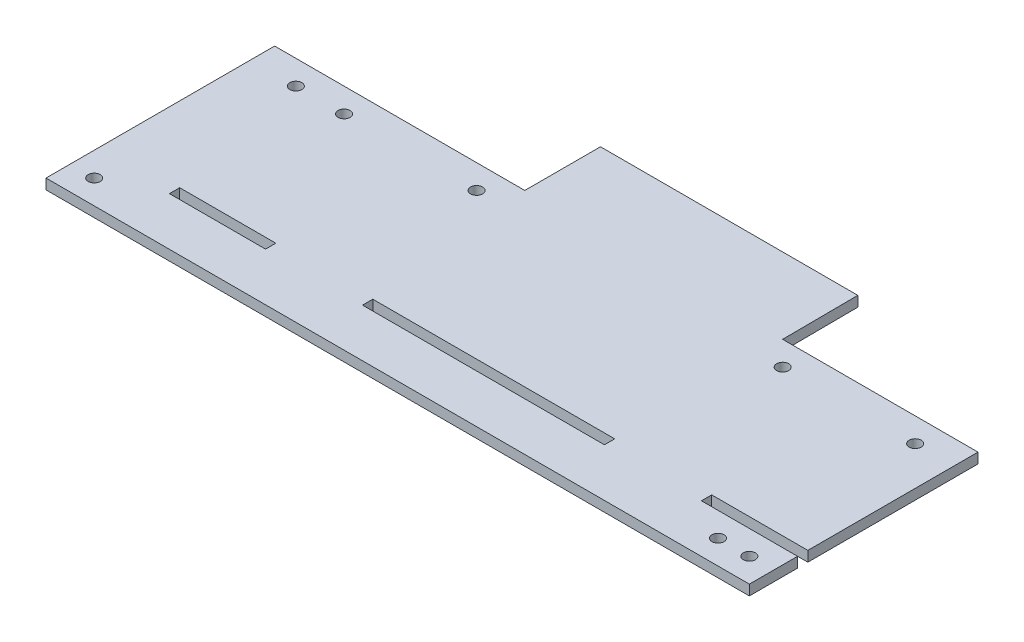
ISO-10303-21;
HEADER;
FILE_DESCRIPTION(('STEP AP214'),'2;1');
FILE_NAME('part.step','',(''),(''),'','','');
FILE_SCHEMA(('AUTOMOTIVE_DESIGN { 1 0 10303 214 1 1 1 1 }'));
ENDSEC;
DATA;
#1=APPLICATION_CONTEXT('core data for automotive mechanical design processes');
#2=APPLICATION_PROTOCOL_DEFINITION('international standard','automotive_design',2000,#1);
#3=PRODUCT_CONTEXT('',#1,'mechanical');
#4=PRODUCT('Part','Part','',(#3));
#5=PRODUCT_RELATED_PRODUCT_CATEGORY('part','',(#4));
#6=PRODUCT_DEFINITION_FORMATION('','',#4);
#7=PRODUCT_DEFINITION_CONTEXT('part definition',#1,'design');
#8=PRODUCT_DEFINITION('design','',#6,#7);
#9=PRODUCT_DEFINITION_SHAPE('','',#8);
#10=(LENGTH_UNIT() NAMED_UNIT(*) SI_UNIT(.MILLI.,.METRE.));
#11=(NAMED_UNIT(*) PLANE_ANGLE_UNIT() SI_UNIT($,.RADIAN.));
#12=(NAMED_UNIT(*) SI_UNIT($,.STERADIAN.) SOLID_ANGLE_UNIT());
#13=UNCERTAINTY_MEASURE_WITH_UNIT(LENGTH_MEASURE(1.E-05),#10,'distance_accuracy_value','');
#14=(GEOMETRIC_REPRESENTATION_CONTEXT(3) GLOBAL_UNCERTAINTY_ASSIGNED_CONTEXT((#13)) GLOBAL_UNIT_ASSIGNED_CONTEXT((#10,
#11,#12)) REPRESENTATION_CONTEXT('',''));
#15=CARTESIAN_POINT('',(0.,0.,0.));
#16=DIRECTION('',(0.,0.,1.));
#17=DIRECTION('',(1.,0.,0.));
#18=AXIS2_PLACEMENT_3D('',#15,#16,#17);
#19=CARTESIAN_POINT('',(75.2475,5.4102,-34.8361));
#20=DIRECTION('',(0.,-1.,0.));
#21=DIRECTION('',(0.,0.,-1.));
#22=AXIS2_PLACEMENT_3D('',#19,#20,#21);
#23=CYLINDRICAL_SURFACE('',#22,3.175);
#24=CARTESIAN_POINT('',(75.2475,5.4102,-34.8361));
#25=DIRECTION('',(0.,1.,0.));
#26=DIRECTION('',(0.,0.,1.));
#27=AXIS2_PLACEMENT_3D('',#24,#25,#26);
#28=CIRCLE('',#27,3.175);
#29=CARTESIAN_POINT('',(75.2475,5.4102,-31.6611));
#30=VERTEX_POINT('',#29);
#31=EDGE_CURVE('E255',#30,#30,#28,.T.);
#32=ORIENTED_EDGE('',*,*,#31,.T.);
#33=EDGE_LOOP('',(#32));
#34=FACE_BOUND('',#33,.T.);
#35=CARTESIAN_POINT('',(75.2475,0.,-34.8361));
#36=DIRECTION('',(0.,1.,0.));
#37=DIRECTION('',(0.,0.,1.));
#38=AXIS2_PLACEMENT_3D('',#35,#36,#37);
#39=CIRCLE('',#38,3.175);
#40=CARTESIAN_POINT('',(75.2475,0.,-31.6611));
#41=VERTEX_POINT('',#40);
#42=EDGE_CURVE('E288',#41,#41,#39,.T.);
#43=ORIENTED_EDGE('',*,*,#42,.F.);
#44=EDGE_LOOP('',(#43));
#45=FACE_BOUND('',#44,.T.);
#46=ADVANCED_FACE('F95',(#34,#45),#23,.F.);
#47=CARTESIAN_POINT('',(145.06956,5.4102,-34.8361));
#48=DIRECTION('',(0.,-1.,0.));
#49=DIRECTION('',(0.,0.,-1.));
#50=AXIS2_PLACEMENT_3D('',#47,#48,#49);
#51=CYLINDRICAL_SURFACE('',#50,3.17499999999997);
#52=CARTESIAN_POINT('',(145.06956,5.4102,-34.8361));
#53=DIRECTION('',(0.,1.,0.));
#54=DIRECTION('',(0.,0.,1.));
#55=AXIS2_PLACEMENT_3D('',#52,#53,#54);
#56=CIRCLE('',#55,3.17499999999997);
#57=CARTESIAN_POINT('',(145.06956,5.4102,-31.6611));
#58=VERTEX_POINT('',#57);
#59=EDGE_CURVE('E358',#58,#58,#56,.T.);
#60=ORIENTED_EDGE('',*,*,#59,.T.);
#61=EDGE_LOOP('',(#60));
#62=FACE_BOUND('',#61,.T.);
#63=CARTESIAN_POINT('',(145.06956,0.,-34.8361));
#64=DIRECTION('',(0.,1.,0.));
#65=DIRECTION('',(0.,0.,1.));
#66=AXIS2_PLACEMENT_3D('',#63,#64,#65);
#67=CIRCLE('',#66,3.17499999999997);
#68=CARTESIAN_POINT('',(145.06956,0.,-31.6611));
#69=VERTEX_POINT('',#68);
#70=EDGE_CURVE('E292',#69,#69,#67,.T.);
#71=ORIENTED_EDGE('',*,*,#70,.F.);
#72=EDGE_LOOP('',(#71));
#73=FACE_BOUND('',#72,.T.);
#74=ADVANCED_FACE('F476',(#62,#73),#51,.F.);
#75=CARTESIAN_POINT('',(-181.229,5.4102,-34.8361));
#76=DIRECTION('',(0.,-1.,0.));
#77=DIRECTION('',(0.,0.,-1.));
#78=AXIS2_PLACEMENT_3D('',#75,#76,#77);
#79=CYLINDRICAL_SURFACE('',#78,3.175);
#80=CARTESIAN_POINT('',(-181.229,5.4102,-34.8361));
#81=DIRECTION('',(0.,1.,0.));
#82=DIRECTION('',(0.,0.,1.));
#83=AXIS2_PLACEMENT_3D('',#80,#81,#82);
#84=CIRCLE('',#83,3.175);
#85=CARTESIAN_POINT('',(-181.229,5.4102,-31.6611));
#86=VERTEX_POINT('',#85);
#87=EDGE_CURVE('E361',#86,#86,#84,.T.);
#88=ORIENTED_EDGE('',*,*,#87,.T.);
#89=EDGE_LOOP('',(#88));
#90=FACE_BOUND('',#89,.T.);
#91=CARTESIAN_POINT('',(-181.229,0.,-34.8361));
#92=DIRECTION('',(0.,1.,0.));
#93=DIRECTION('',(0.,0.,1.));
#94=AXIS2_PLACEMENT_3D('',#91,#92,#93);
#95=CIRCLE('',#94,3.175);
#96=CARTESIAN_POINT('',(-181.229,0.,-31.6611));
#97=VERTEX_POINT('',#96);
#98=EDGE_CURVE('E295',#97,#97,#95,.T.);
#99=ORIENTED_EDGE('',*,*,#98,.F.);
#100=EDGE_LOOP('',(#99));
#101=FACE_BOUND('',#100,.T.);
#102=ADVANCED_FACE('F482',(#90,#101),#79,.F.);
#103=CARTESIAN_POINT('',(-192.405,5.4102,60.2361));
#104=DIRECTION('',(0.,-1.,0.));
#105=DIRECTION('',(0.,0.,-1.));
#106=AXIS2_PLACEMENT_3D('',#103,#104,#105);
#107=CYLINDRICAL_SURFACE('',#106,3.175);
#108=CARTESIAN_POINT('',(-192.405,5.4102,60.2361));
#109=DIRECTION('',(0.,1.,0.));
#110=DIRECTION('',(0.,0.,1.));
#111=AXIS2_PLACEMENT_3D('',#108,#109,#110);
#112=CIRCLE('',#111,3.175);
#113=CARTESIAN_POINT('',(-192.405,5.4102,63.4111));
#114=VERTEX_POINT('',#113);
#115=EDGE_CURVE('E364',#114,#114,#112,.T.);
#116=ORIENTED_EDGE('',*,*,#115,.T.);
#117=EDGE_LOOP('',(#116));
#118=FACE_BOUND('',#117,.T.);
#119=CARTESIAN_POINT('',(-192.405,0.,60.2361));
#120=DIRECTION('',(0.,1.,0.));
#121=DIRECTION('',(0.,0.,1.));
#122=AXIS2_PLACEMENT_3D('',#119,#120,#121);
#123=CIRCLE('',#122,3.175);
#124=CARTESIAN_POINT('',(-192.405,0.,63.4111));
#125=VERTEX_POINT('',#124);
#126=EDGE_CURVE('E298',#125,#125,#123,.T.);
#127=ORIENTED_EDGE('',*,*,#126,.F.);
#128=EDGE_LOOP('',(#127));
#129=FACE_BOUND('',#128,.T.);
#130=ADVANCED_FACE('F489',(#118,#129),#107,.F.);
#131=CARTESIAN_POINT('',(152.781,5.4102,60.2361));
#132=DIRECTION('',(0.,-1.,0.));
#133=DIRECTION('',(0.,0.,-1.));
#134=AXIS2_PLACEMENT_3D('',#131,#132,#133);
#135=CYLINDRICAL_SURFACE('',#134,3.175);
#136=CARTESIAN_POINT('',(152.781,5.4102,60.2361));
#137=DIRECTION('',(0.,1.,0.));
#138=DIRECTION('',(0.,0.,1.));
#139=AXIS2_PLACEMENT_3D('',#136,#137,#138);
#140=CIRCLE('',#139,3.175);
#141=CARTESIAN_POINT('',(152.781,5.4102,63.4111));
#142=VERTEX_POINT('',#141);
#143=EDGE_CURVE('E367',#142,#142,#140,.T.);
#144=ORIENTED_EDGE('',*,*,#143,.T.);
#145=EDGE_LOOP('',(#144));
#146=FACE_BOUND('',#145,.T.);
#147=CARTESIAN_POINT('',(152.781,0.,60.2361));
#148=DIRECTION('',(0.,1.,0.));
#149=DIRECTION('',(0.,0.,1.));
#150=AXIS2_PLACEMENT_3D('',#147,#148,#149);
#151=CIRCLE('',#150,3.175);
#152=CARTESIAN_POINT('',(152.781,0.,63.4111));
#153=VERTEX_POINT('',#152);
#154=EDGE_CURVE('E301',#153,#153,#151,.T.);
#155=ORIENTED_EDGE('',*,*,#154,.F.);
#156=EDGE_LOOP('',(#155));
#157=FACE_BOUND('',#156,.T.);
#158=ADVANCED_FACE('F493',(#146,#157),#135,.F.);
#159=CARTESIAN_POINT('',(136.271,5.4102,60.2361));
#160=DIRECTION('',(0.,-1.,0.));
#161=DIRECTION('',(0.,0.,-1.));
#162=AXIS2_PLACEMENT_3D('',#159,#160,#161);
#163=CYLINDRICAL_SURFACE('',#162,3.175);
#164=CARTESIAN_POINT('',(136.271,5.4102,60.2361));
#165=DIRECTION('',(0.,1.,0.));
#166=DIRECTION('',(0.,0.,1.));
#167=AXIS2_PLACEMENT_3D('',#164,#165,#166);
#168=CIRCLE('',#167,3.175);
#169=CARTESIAN_POINT('',(136.271,5.4102,63.4111));
#170=VERTEX_POINT('',#169);
#171=EDGE_CURVE('E370',#170,#170,#168,.T.);
#172=ORIENTED_EDGE('',*,*,#171,.T.);
#173=EDGE_LOOP('',(#172));
#174=FACE_BOUND('',#173,.T.);
#175=CARTESIAN_POINT('',(136.271,0.,60.2361));
#176=DIRECTION('',(0.,1.,0.));
#177=DIRECTION('',(0.,0.,1.));
#178=AXIS2_PLACEMENT_3D('',#175,#176,#177);
#179=CIRCLE('',#178,3.175);
#180=CARTESIAN_POINT('',(136.271,0.,63.4111));
#181=VERTEX_POINT('',#180);
#182=EDGE_CURVE('E304',#181,#181,#179,.T.);
#183=ORIENTED_EDGE('',*,*,#182,.F.);
#184=EDGE_LOOP('',(#183));
#185=FACE_BOUND('',#184,.T.);
#186=ADVANCED_FACE('F497',(#174,#185),#163,.F.);
#187=CARTESIAN_POINT('',(-155.829,5.4102,-34.8361));
#188=DIRECTION('',(0.,-1.,0.));
#189=DIRECTION('',(0.,0.,-1.));
#190=AXIS2_PLACEMENT_3D('',#187,#188,#189);
#191=CYLINDRICAL_SURFACE('',#190,3.175);
#192=CARTESIAN_POINT('',(-155.829,5.4102,-34.8361));
#193=DIRECTION('',(0.,1.,0.));
#194=DIRECTION('',(0.,0.,1.));
#195=AXIS2_PLACEMENT_3D('',#192,#193,#194);
#196=CIRCLE('',#195,3.175);
#197=CARTESIAN_POINT('',(-155.829,5.4102,-31.6611));
#198=VERTEX_POINT('',#197);
#199=EDGE_CURVE('E373',#198,#198,#196,.T.);
#200=ORIENTED_EDGE('',*,*,#199,.T.);
#201=EDGE_LOOP('',(#200));
#202=FACE_BOUND('',#201,.T.);
#203=CARTESIAN_POINT('',(-155.829,0.,-34.8361));
#204=DIRECTION('',(0.,1.,0.));
#205=DIRECTION('',(0.,0.,1.));
#206=AXIS2_PLACEMENT_3D('',#203,#204,#205);
#207=CIRCLE('',#206,3.175);
#208=CARTESIAN_POINT('',(-155.829,0.,-31.6611));
#209=VERTEX_POINT('',#208);
#210=EDGE_CURVE('E307',#209,#209,#207,.T.);
#211=ORIENTED_EDGE('',*,*,#210,.F.);
#212=EDGE_LOOP('',(#211));
#213=FACE_BOUND('',#212,.T.);
#214=ADVANCED_FACE('F501',(#202,#213),#191,.F.);
#215=CARTESIAN_POINT('',(-86.0069399999999,5.4102,-34.8361));
#216=DIRECTION('',(0.,-1.,0.));
#217=DIRECTION('',(0.,0.,-1.));
#218=AXIS2_PLACEMENT_3D('',#215,#216,#217);
#219=CYLINDRICAL_SURFACE('',#218,3.175);
#220=CARTESIAN_POINT('',(-86.0069399999999,5.4102,-34.8361));
#221=DIRECTION('',(0.,1.,0.));
#222=DIRECTION('',(0.,0.,1.));
#223=AXIS2_PLACEMENT_3D('',#220,#221,#222);
#224=CIRCLE('',#223,3.175);
#225=CARTESIAN_POINT('',(-86.0069399999999,5.4102,-31.6611));
#226=VERTEX_POINT('',#225);
#227=EDGE_CURVE('E376',#226,#226,#224,.T.);
#228=ORIENTED_EDGE('',*,*,#227,.T.);
#229=EDGE_LOOP('',(#228));
#230=FACE_BOUND('',#229,.T.);
#231=CARTESIAN_POINT('',(-86.0069399999999,0.,-34.8361));
#232=DIRECTION('',(0.,1.,0.));
#233=DIRECTION('',(0.,0.,1.));
#234=AXIS2_PLACEMENT_3D('',#231,#232,#233);
#235=CIRCLE('',#234,3.175);
#236=CARTESIAN_POINT('',(-86.0069399999999,0.,-31.6611));
#237=VERTEX_POINT('',#236);
#238=EDGE_CURVE('E310',#237,#237,#235,.T.);
#239=ORIENTED_EDGE('',*,*,#238,.F.);
#240=EDGE_LOOP('',(#239));
#241=FACE_BOUND('',#240,.T.);
#242=ADVANCED_FACE('F505',(#230,#241),#219,.F.);
#243=CARTESIAN_POINT('',(-165.481,5.4102,0.));
#244=DIRECTION('',(-1.,0.,0.));
#245=DIRECTION('',(0.,0.,1.));
#246=AXIS2_PLACEMENT_3D('',#243,#244,#245);
#247=PLANE('',#246);
#248=DIRECTION('',(0.,0.,-1.));
#249=VECTOR('',#248,1.);
#250=CARTESIAN_POINT('',(-165.481,0.,0.));
#251=LINE('',#250,#249);
#252=CARTESIAN_POINT('',(-165.481,0.,47.5361));
#253=VERTEX_POINT('',#252);
#254=CARTESIAN_POINT('',(-165.481,0.,42.1259));
#255=VERTEX_POINT('',#254);
#256=EDGE_CURVE('E247',#253,#255,#251,.T.);
#257=ORIENTED_EDGE('',*,*,#256,.T.);
#258=DIRECTION('',(0.,-1.,0.));
#259=VECTOR('',#258,1.);
#260=CARTESIAN_POINT('',(-165.481,5.4102,42.1259));
#261=LINE('',#260,#259);
#262=CARTESIAN_POINT('',(-165.481,5.4102,42.1259));
#263=VERTEX_POINT('',#262);
#264=EDGE_CURVE('E105',#263,#255,#261,.T.);
#265=ORIENTED_EDGE('',*,*,#264,.F.);
#266=DIRECTION('',(0.,0.,-1.));
#267=VECTOR('',#266,1.);
#268=CARTESIAN_POINT('',(-165.481,5.4102,0.));
#269=LINE('',#268,#267);
#270=CARTESIAN_POINT('',(-165.481,5.4102,47.5361));
#271=VERTEX_POINT('',#270);
#272=EDGE_CURVE('E236',#271,#263,#269,.T.);
#273=ORIENTED_EDGE('',*,*,#272,.F.);
#274=DIRECTION('',(0.,-1.,0.));
#275=VECTOR('',#274,1.);
#276=CARTESIAN_POINT('',(-165.481,5.4102,47.5361));
#277=LINE('',#276,#275);
#278=EDGE_CURVE('E12',#271,#253,#277,.T.);
#279=ORIENTED_EDGE('',*,*,#278,.T.);
#280=EDGE_LOOP('',(#257,#265,#273,#279));
#281=FACE_BOUND('',#280,.T.);
#282=ADVANCED_FACE('F245',(#281),#247,.F.);
#283=CARTESIAN_POINT('',(0.,5.4102,42.1259));
#284=DIRECTION('',(0.,0.,-1.));
#285=DIRECTION('',(-1.,0.,0.));
#286=AXIS2_PLACEMENT_3D('',#283,#284,#285);
#287=PLANE('',#286);
#288=DIRECTION('',(1.,0.,0.));
#289=VECTOR('',#288,1.);
#290=CARTESIAN_POINT('',(0.,0.,42.1259));
#291=LINE('',#290,#289);
#292=CARTESIAN_POINT('',(-114.8334,0.,42.1259));
#293=VERTEX_POINT('',#292);
#294=EDGE_CURVE('E316',#255,#293,#291,.T.);
#295=ORIENTED_EDGE('',*,*,#294,.T.);
#296=DIRECTION('',(0.,-1.,0.));
#297=VECTOR('',#296,1.);
#298=CARTESIAN_POINT('',(-114.8334,5.4102,42.1259));
#299=LINE('',#298,#297);
#300=CARTESIAN_POINT('',(-114.8334,5.4102,42.1259));
#301=VERTEX_POINT('',#300);
#302=EDGE_CURVE('E171',#301,#293,#299,.T.);
#303=ORIENTED_EDGE('',*,*,#302,.F.);
#304=DIRECTION('',(1.,0.,0.));
#305=VECTOR('',#304,1.);
#306=CARTESIAN_POINT('',(0.,5.4102,42.1259));
#307=LINE('',#306,#305);
#308=EDGE_CURVE('E228',#263,#301,#307,.T.);
#309=ORIENTED_EDGE('',*,*,#308,.F.);
#310=ORIENTED_EDGE('',*,*,#264,.T.);
#311=EDGE_LOOP('',(#295,#303,#309,#310));
#312=FACE_BOUND('',#311,.T.);
#313=ADVANCED_FACE('F230',(#312),#287,.F.);
#314=CARTESIAN_POINT('',(-114.8334,5.4102,0.));
#315=DIRECTION('',(-1.,0.,0.));
#316=DIRECTION('',(0.,0.,1.));
#317=AXIS2_PLACEMENT_3D('',#314,#315,#316);
#318=PLANE('',#317);
#319=DIRECTION('',(0.,0.,-1.));
#320=VECTOR('',#319,1.);
#321=CARTESIAN_POINT('',(-114.8334,0.,0.));
#322=LINE('',#321,#320);
#323=CARTESIAN_POINT('',(-114.8334,0.,47.5361));
#324=VERTEX_POINT('',#323);
#325=EDGE_CURVE('E313',#324,#293,#322,.T.);
#326=ORIENTED_EDGE('',*,*,#325,.F.);
#327=DIRECTION('',(0.,-1.,0.));
#328=VECTOR('',#327,1.);
#329=CARTESIAN_POINT('',(-114.8334,5.4102,47.5361));
#330=LINE('',#329,#328);
#331=CARTESIAN_POINT('',(-114.8334,5.4102,47.5361));
#332=VERTEX_POINT('',#331);
#333=EDGE_CURVE('E114',#332,#324,#330,.T.);
#334=ORIENTED_EDGE('',*,*,#333,.F.);
#335=DIRECTION('',(0.,0.,-1.));
#336=VECTOR('',#335,1.);
#337=CARTESIAN_POINT('',(-114.8334,5.4102,0.));
#338=LINE('',#337,#336);
#339=EDGE_CURVE('E235',#332,#301,#338,.T.);
#340=ORIENTED_EDGE('',*,*,#339,.T.);
#341=ORIENTED_EDGE('',*,*,#302,.T.);
#342=EDGE_LOOP('',(#326,#334,#340,#341));
#343=FACE_BOUND('',#342,.T.);
#344=ADVANCED_FACE('F510',(#343),#318,.T.);
#345=CARTESIAN_POINT('',(0.,5.4102,47.5361));
#346=DIRECTION('',(0.,0.,-1.));
#347=DIRECTION('',(-1.,0.,0.));
#348=AXIS2_PLACEMENT_3D('',#345,#346,#347);
#349=PLANE('',#348);
#350=DIRECTION('',(1.,0.,0.));
#351=VECTOR('',#350,1.);
#352=CARTESIAN_POINT('',(0.,0.,47.5361));
#353=LINE('',#352,#351);
#354=EDGE_CURVE('E319',#253,#324,#353,.T.);
#355=ORIENTED_EDGE('',*,*,#354,.F.);
#356=ORIENTED_EDGE('',*,*,#278,.F.);
#357=DIRECTION('',(1.,0.,0.));
#358=VECTOR('',#357,1.);
#359=CARTESIAN_POINT('',(0.,5.4102,47.5361));
#360=LINE('',#359,#358);
#361=EDGE_CURVE('E242',#271,#332,#360,.T.);
#362=ORIENTED_EDGE('',*,*,#361,.T.);
#363=ORIENTED_EDGE('',*,*,#333,.T.);
#364=EDGE_LOOP('',(#355,#356,#362,#363));
#365=FACE_BOUND('',#364,.T.);
#366=ADVANCED_FACE('F513',(#365),#349,.T.);
#367=CARTESIAN_POINT('',(114.8334,5.4102,0.));
#368=DIRECTION('',(-1.,0.,0.));
#369=DIRECTION('',(0.,0.,1.));
#370=AXIS2_PLACEMENT_3D('',#367,#368,#369);
#371=PLANE('',#370);
#372=DIRECTION('',(0.,0.,-1.));
#373=VECTOR('',#372,1.);
#374=CARTESIAN_POINT('',(114.8334,0.,0.));
#375=LINE('',#374,#373);
#376=CARTESIAN_POINT('',(114.8334,0.,47.5361));
#377=VERTEX_POINT('',#376);
#378=CARTESIAN_POINT('',(114.8334,0.,42.1259));
#379=VERTEX_POINT('',#378);
#380=EDGE_CURVE('E350',#377,#379,#375,.T.);
#381=ORIENTED_EDGE('',*,*,#380,.T.);
#382=DIRECTION('',(0.,-1.,0.));
#383=VECTOR('',#382,1.);
#384=CARTESIAN_POINT('',(114.8334,5.4102,42.1259));
#385=LINE('',#384,#383);
#386=CARTESIAN_POINT('',(114.8334,5.4102,42.1259));
#387=VERTEX_POINT('',#386);
#388=EDGE_CURVE('E279',#387,#379,#385,.T.);
#389=ORIENTED_EDGE('',*,*,#388,.F.);
#390=DIRECTION('',(0.,0.,-1.));
#391=VECTOR('',#390,1.);
#392=CARTESIAN_POINT('',(114.8334,5.4102,0.));
#393=LINE('',#392,#391);
#394=CARTESIAN_POINT('',(114.8334,5.4102,47.5361));
#395=VERTEX_POINT('',#394);
#396=EDGE_CURVE('E405',#395,#387,#393,.T.);
#397=ORIENTED_EDGE('',*,*,#396,.F.);
#398=DIRECTION('',(0.,-1.,0.));
#399=VECTOR('',#398,1.);
#400=CARTESIAN_POINT('',(114.8334,5.4102,47.5361));
#401=LINE('',#400,#399);
#402=EDGE_CURVE('E99',#395,#377,#401,.T.);
#403=ORIENTED_EDGE('',*,*,#402,.T.);
#404=EDGE_LOOP('',(#381,#389,#397,#403));
#405=FACE_BOUND('',#404,.T.);
#406=ADVANCED_FACE('F97',(#405),#371,.F.);
#407=CARTESIAN_POINT('',(0.,5.4102,42.1259));
#408=DIRECTION('',(0.,0.,1.));
#409=DIRECTION('',(1.,0.,0.));
#410=AXIS2_PLACEMENT_3D('',#407,#408,#409);
#411=PLANE('',#410);
#412=DIRECTION('',(-1.,0.,0.));
#413=VECTOR('',#412,1.);
#414=CARTESIAN_POINT('',(0.,0.,42.1259));
#415=LINE('',#414,#413);
#416=CARTESIAN_POINT('',(165.481,0.,42.1259));
#417=VERTEX_POINT('',#416);
#418=EDGE_CURVE('E347',#417,#379,#415,.T.);
#419=ORIENTED_EDGE('',*,*,#418,.F.);
#420=DIRECTION('',(0.,-1.,0.));
#421=VECTOR('',#420,1.);
#422=CARTESIAN_POINT('',(165.481,5.4102,42.1259));
#423=LINE('',#422,#421);
#424=CARTESIAN_POINT('',(165.481,5.4102,42.1259));
#425=VERTEX_POINT('',#424);
#426=EDGE_CURVE('E278',#425,#417,#423,.T.);
#427=ORIENTED_EDGE('',*,*,#426,.F.);
#428=DIRECTION('',(-1.,0.,0.));
#429=VECTOR('',#428,1.);
#430=CARTESIAN_POINT('',(0.,5.4102,42.1259));
#431=LINE('',#430,#429);
#432=EDGE_CURVE('E403',#425,#387,#431,.T.);
#433=ORIENTED_EDGE('',*,*,#432,.T.);
#434=ORIENTED_EDGE('',*,*,#388,.T.);
#435=EDGE_LOOP('',(#419,#427,#433,#434));
#436=FACE_BOUND('',#435,.T.);
#437=ADVANCED_FACE('F553',(#436),#411,.T.);
#438=CARTESIAN_POINT('',(165.481,5.4102,0.));
#439=DIRECTION('',(-1.,0.,0.));
#440=DIRECTION('',(0.,0.,1.));
#441=AXIS2_PLACEMENT_3D('',#438,#439,#440);
#442=PLANE('',#441);
#443=DIRECTION('',(0.,0.,-1.));
#444=VECTOR('',#443,1.);
#445=CARTESIAN_POINT('',(165.481,0.,0.));
#446=LINE('',#445,#444);
#447=CARTESIAN_POINT('',(165.481,0.,-47.5361));
#448=VERTEX_POINT('',#447);
#449=EDGE_CURVE('E344',#417,#448,#446,.T.);
#450=ORIENTED_EDGE('',*,*,#449,.T.);
#451=DIRECTION('',(0.,-1.,0.));
#452=VECTOR('',#451,1.);
#453=CARTESIAN_POINT('',(165.481,5.4102,-47.5361));
#454=LINE('',#453,#452);
#455=CARTESIAN_POINT('',(165.481,5.4102,-47.5361));
#456=VERTEX_POINT('',#455);
#457=EDGE_CURVE('E276',#456,#448,#454,.T.);
#458=ORIENTED_EDGE('',*,*,#457,.F.);
#459=DIRECTION('',(0.,0.,-1.));
#460=VECTOR('',#459,1.);
#461=CARTESIAN_POINT('',(165.481,5.4102,0.));
#462=LINE('',#461,#460);
#463=EDGE_CURVE('E401',#425,#456,#462,.T.);
#464=ORIENTED_EDGE('',*,*,#463,.F.);
#465=ORIENTED_EDGE('',*,*,#426,.T.);
#466=EDGE_LOOP('',(#450,#458,#464,#465));
#467=FACE_BOUND('',#466,.T.);
#468=ADVANCED_FACE('F551',(#467),#442,.F.);
#469=CARTESIAN_POINT('',(0.,5.4102,-47.5361));
#470=DIRECTION('',(0.,0.,-1.));
#471=DIRECTION('',(-1.,0.,0.));
#472=AXIS2_PLACEMENT_3D('',#469,#470,#471);
#473=PLANE('',#472);
#474=DIRECTION('',(1.,0.,0.));
#475=VECTOR('',#474,1.);
#476=CARTESIAN_POINT('',(0.,0.,-47.5361));
#477=LINE('',#476,#475);
#478=CARTESIAN_POINT('',(62.5475,0.,-47.5361));
#479=VERTEX_POINT('',#478);
#480=EDGE_CURVE('E341',#479,#448,#477,.T.);
#481=ORIENTED_EDGE('',*,*,#480,.F.);
#482=DIRECTION('',(0.,-1.,0.));
#483=VECTOR('',#482,1.);
#484=CARTESIAN_POINT('',(62.5475,5.4102,-47.5361));
#485=LINE('',#484,#483);
#486=CARTESIAN_POINT('',(62.5475,5.4102,-47.5361));
#487=VERTEX_POINT('',#486);
#488=EDGE_CURVE('E273',#487,#479,#485,.T.);
#489=ORIENTED_EDGE('',*,*,#488,.F.);
#490=DIRECTION('',(1.,0.,0.));
#491=VECTOR('',#490,1.);
#492=CARTESIAN_POINT('',(0.,5.4102,-47.5361));
#493=LINE('',#492,#491);
#494=EDGE_CURVE('E398',#487,#456,#493,.T.);
#495=ORIENTED_EDGE('',*,*,#494,.T.);
#496=ORIENTED_EDGE('',*,*,#457,.T.);
#497=EDGE_LOOP('',(#481,#489,#495,#496));
#498=FACE_BOUND('',#497,.T.);
#499=ADVANCED_FACE('F444',(#498),#473,.T.);
#500=CARTESIAN_POINT('',(0.,5.4102,42.1259));
#501=DIRECTION('',(0.,0.,-1.));
#502=DIRECTION('',(-1.,0.,0.));
#503=AXIS2_PLACEMENT_3D('',#500,#501,#502);
#504=PLANE('',#503);
#505=DIRECTION('',(1.,0.,0.));
#506=VECTOR('',#505,1.);
#507=CARTESIAN_POINT('',(0.,0.,42.1259));
#508=LINE('',#507,#506);
#509=CARTESIAN_POINT('',(-63.7285999999999,0.,42.1259));
#510=VERTEX_POINT('',#509);
#511=CARTESIAN_POINT('',(63.7286,0.,42.1259));
#512=VERTEX_POINT('',#511);
#513=EDGE_CURVE('E338',#510,#512,#508,.T.);
#514=ORIENTED_EDGE('',*,*,#513,.T.);
#515=DIRECTION('',(0.,-1.,0.));
#516=VECTOR('',#515,1.);
#517=CARTESIAN_POINT('',(63.7286,5.4102,42.1259));
#518=LINE('',#517,#516);
#519=CARTESIAN_POINT('',(63.7286,5.4102,42.1259));
#520=VERTEX_POINT('',#519);
#521=EDGE_CURVE('E271',#520,#512,#518,.T.);
#522=ORIENTED_EDGE('',*,*,#521,.F.);
#523=DIRECTION('',(1.,0.,0.));
#524=VECTOR('',#523,1.);
#525=CARTESIAN_POINT('',(0.,5.4102,42.1259));
#526=LINE('',#525,#524);
#527=CARTESIAN_POINT('',(-63.7285999999999,5.4102,42.1259));
#528=VERTEX_POINT('',#527);
#529=EDGE_CURVE('E396',#528,#520,#526,.T.);
#530=ORIENTED_EDGE('',*,*,#529,.F.);
#531=DIRECTION('',(0.,-1.,0.));
#532=VECTOR('',#531,1.);
#533=CARTESIAN_POINT('',(-63.7285999999999,5.4102,42.1259));
#534=LINE('',#533,#532);
#535=EDGE_CURVE('E264',#528,#510,#534,.T.);
#536=ORIENTED_EDGE('',*,*,#535,.T.);
#537=EDGE_LOOP('',(#514,#522,#530,#536));
#538=FACE_BOUND('',#537,.T.);
#539=ADVANCED_FACE('F544',(#538),#504,.F.);
#540=CARTESIAN_POINT('',(63.7286,5.4102,0.));
#541=DIRECTION('',(-1.,0.,0.));
#542=DIRECTION('',(0.,0.,1.));
#543=AXIS2_PLACEMENT_3D('',#540,#541,#542);
#544=PLANE('',#543);
#545=DIRECTION('',(0.,0.,-1.));
#546=VECTOR('',#545,1.);
#547=CARTESIAN_POINT('',(63.7286,0.,0.));
#548=LINE('',#547,#546);
#549=CARTESIAN_POINT('',(63.7286,0.,47.5361));
#550=VERTEX_POINT('',#549);
#551=EDGE_CURVE('E335',#550,#512,#548,.T.);
#552=ORIENTED_EDGE('',*,*,#551,.F.);
#553=DIRECTION('',(0.,-1.,0.));
#554=VECTOR('',#553,1.);
#555=CARTESIAN_POINT('',(63.7286,5.4102,47.5361));
#556=LINE('',#555,#554);
#557=CARTESIAN_POINT('',(63.7286,5.4102,47.5361));
#558=VERTEX_POINT('',#557);
#559=EDGE_CURVE('E269',#558,#550,#556,.T.);
#560=ORIENTED_EDGE('',*,*,#559,.F.);
#561=DIRECTION('',(0.,0.,-1.));
#562=VECTOR('',#561,1.);
#563=CARTESIAN_POINT('',(63.7286,5.4102,0.));
#564=LINE('',#563,#562);
#565=EDGE_CURVE('E393',#558,#520,#564,.T.);
#566=ORIENTED_EDGE('',*,*,#565,.T.);
#567=ORIENTED_EDGE('',*,*,#521,.T.);
#568=EDGE_LOOP('',(#552,#560,#566,#567));
#569=FACE_BOUND('',#568,.T.);
#570=ADVANCED_FACE('F541',(#569),#544,.T.);
#571=CARTESIAN_POINT('',(-63.7285999999999,0.,47.5361));
#572=VERTEX_POINT('',#571);
#573=EDGE_CURVE('E334',#572,#550,#353,.T.);
#574=ORIENTED_EDGE('',*,*,#573,.F.);
#575=DIRECTION('',(0.,-1.,0.));
#576=VECTOR('',#575,1.);
#577=CARTESIAN_POINT('',(-63.7285999999999,5.4102,47.5361));
#578=LINE('',#577,#576);
#579=CARTESIAN_POINT('',(-63.7285999999999,5.4102,47.5361));
#580=VERTEX_POINT('',#579);
#581=EDGE_CURVE('E267',#580,#572,#578,.T.);
#582=ORIENTED_EDGE('',*,*,#581,.F.);
#583=EDGE_CURVE('E392',#580,#558,#360,.T.);
#584=ORIENTED_EDGE('',*,*,#583,.T.);
#585=ORIENTED_EDGE('',*,*,#559,.T.);
#586=EDGE_LOOP('',(#574,#582,#584,#585));
#587=FACE_BOUND('',#586,.T.);
#588=ADVANCED_FACE('F520',(#587),#349,.T.);
#589=CARTESIAN_POINT('',(-63.7285999999999,5.4102,0.));
#590=DIRECTION('',(-1.,0.,0.));
#591=DIRECTION('',(0.,0.,1.));
#592=AXIS2_PLACEMENT_3D('',#589,#590,#591);
#593=PLANE('',#592);
#594=DIRECTION('',(0.,0.,-1.));
#595=VECTOR('',#594,1.);
#596=CARTESIAN_POINT('',(-63.7285999999999,0.,0.));
#597=LINE('',#596,#595);
#598=EDGE_CURVE('E331',#572,#510,#597,.T.);
#599=ORIENTED_EDGE('',*,*,#598,.T.);
#600=ORIENTED_EDGE('',*,*,#535,.F.);
#601=DIRECTION('',(0.,0.,-1.));
#602=VECTOR('',#601,1.);
#603=CARTESIAN_POINT('',(-63.7285999999999,5.4102,0.));
#604=LINE('',#603,#602);
#605=EDGE_CURVE('E389',#580,#528,#604,.T.);
#606=ORIENTED_EDGE('',*,*,#605,.F.);
#607=ORIENTED_EDGE('',*,*,#581,.T.);
#608=EDGE_LOOP('',(#599,#600,#606,#607));
#609=FACE_BOUND('',#608,.T.);
#610=ADVANCED_FACE('F536',(#609),#593,.F.);
#611=CARTESIAN_POINT('',(0.,5.4102,-47.5361));
#612=DIRECTION('',(0.,0.,-1.));
#613=DIRECTION('',(-1.,0.,0.));
#614=AXIS2_PLACEMENT_3D('',#611,#612,#613);
#615=PLANE('',#614);
#616=DIRECTION('',(1.,0.,0.));
#617=VECTOR('',#616,1.);
#618=CARTESIAN_POINT('',(0.,0.,-47.5361));
#619=LINE('',#618,#617);
#620=CARTESIAN_POINT('',(-205.105,0.,-47.5361));
#621=VERTEX_POINT('',#620);
#622=CARTESIAN_POINT('',(-73.30694,0.,-47.5361));
#623=VERTEX_POINT('',#622);
#624=EDGE_CURVE('E328',#621,#623,#619,.T.);
#625=ORIENTED_EDGE('',*,*,#624,.F.);
#626=DIRECTION('',(0.,-1.,0.));
#627=VECTOR('',#626,1.);
#628=CARTESIAN_POINT('',(-205.105,5.4102,-47.5361));
#629=LINE('',#628,#627);
#630=CARTESIAN_POINT('',(-205.105,5.4102,-47.5361));
#631=VERTEX_POINT('',#630);
#632=EDGE_CURVE('E260',#631,#621,#629,.T.);
#633=ORIENTED_EDGE('',*,*,#632,.F.);
#634=DIRECTION('',(1.,0.,0.));
#635=VECTOR('',#634,1.);
#636=CARTESIAN_POINT('',(0.,5.4102,-47.5361));
#637=LINE('',#636,#635);
#638=CARTESIAN_POINT('',(-73.30694,5.4102,-47.5361));
#639=VERTEX_POINT('',#638);
#640=EDGE_CURVE('E387',#631,#639,#637,.T.);
#641=ORIENTED_EDGE('',*,*,#640,.T.);
#642=DIRECTION('',(0.,-1.,0.));
#643=VECTOR('',#642,1.);
#644=CARTESIAN_POINT('',(-73.30694,5.4102,-47.5361));
#645=LINE('',#644,#643);
#646=EDGE_CURVE('E262',#639,#623,#645,.T.);
#647=ORIENTED_EDGE('',*,*,#646,.T.);
#648=EDGE_LOOP('',(#625,#633,#641,#647));
#649=FACE_BOUND('',#648,.T.);
#650=ADVANCED_FACE('F532',(#649),#615,.T.);
#651=CARTESIAN_POINT('',(-205.105,5.4102,4.48252546192407E-13));
#652=DIRECTION('',(1.,0.,0.));
#653=DIRECTION('',(0.,0.,-1.));
#654=AXIS2_PLACEMENT_3D('',#651,#652,#653);
#655=PLANE('',#654);
#656=DIRECTION('',(0.,0.,1.));
#657=VECTOR('',#656,1.);
#658=CARTESIAN_POINT('',(-205.105,0.,4.48252546192407E-13));
#659=LINE('',#658,#657);
#660=CARTESIAN_POINT('',(-205.105,0.,72.9361));
#661=VERTEX_POINT('',#660);
#662=EDGE_CURVE('E326',#621,#661,#659,.T.);
#663=ORIENTED_EDGE('',*,*,#662,.T.);
#664=DIRECTION('',(0.,-1.,0.));
#665=VECTOR('',#664,1.);
#666=CARTESIAN_POINT('',(-205.105,5.4102,72.9361));
#667=LINE('',#666,#665);
#668=CARTESIAN_POINT('',(-205.105,5.4102,72.9361));
#669=VERTEX_POINT('',#668);
#670=EDGE_CURVE('E257',#669,#661,#667,.T.);
#671=ORIENTED_EDGE('',*,*,#670,.F.);
#672=DIRECTION('',(0.,0.,1.));
#673=VECTOR('',#672,1.);
#674=CARTESIAN_POINT('',(-205.105,5.4102,4.48252546192407E-13));
#675=LINE('',#674,#673);
#676=EDGE_CURVE('E385',#631,#669,#675,.T.);
#677=ORIENTED_EDGE('',*,*,#676,.F.);
#678=ORIENTED_EDGE('',*,*,#632,.T.);
#679=EDGE_LOOP('',(#663,#671,#677,#678));
#680=FACE_BOUND('',#679,.T.);
#681=ADVANCED_FACE('F528',(#680),#655,.F.);
#682=CARTESIAN_POINT('',(0.,5.4102,72.9361));
#683=DIRECTION('',(0.,0.,-1.));
#684=DIRECTION('',(-1.,0.,0.));
#685=AXIS2_PLACEMENT_3D('',#682,#683,#684);
#686=PLANE('',#685);
#687=DIRECTION('',(1.,0.,0.));
#688=VECTOR('',#687,1.);
#689=CARTESIAN_POINT('',(0.,0.,72.9361));
#690=LINE('',#689,#688);
#691=CARTESIAN_POINT('',(165.481,0.,72.9361));
#692=VERTEX_POINT('',#691);
#693=EDGE_CURVE('E323',#661,#692,#690,.T.);
#694=ORIENTED_EDGE('',*,*,#693,.T.);
#695=DIRECTION('',(0.,-1.,0.));
#696=VECTOR('',#695,1.);
#697=CARTESIAN_POINT('',(165.481,5.4102,72.9361));
#698=LINE('',#697,#696);
#699=CARTESIAN_POINT('',(165.481,5.4102,72.9361));
#700=VERTEX_POINT('',#699);
#701=EDGE_CURVE('E254',#700,#692,#698,.T.);
#702=ORIENTED_EDGE('',*,*,#701,.F.);
#703=DIRECTION('',(1.,0.,0.));
#704=VECTOR('',#703,1.);
#705=CARTESIAN_POINT('',(0.,5.4102,72.9361));
#706=LINE('',#705,#704);
#707=EDGE_CURVE('E383',#669,#700,#706,.T.);
#708=ORIENTED_EDGE('',*,*,#707,.F.);
#709=ORIENTED_EDGE('',*,*,#670,.T.);
#710=EDGE_LOOP('',(#694,#702,#708,#709));
#711=FACE_BOUND('',#710,.T.);
#712=ADVANCED_FACE('F524',(#711),#686,.F.);
#713=CARTESIAN_POINT('',(165.481,5.4102,-1.80827575135822E-13));
#714=DIRECTION('',(1.,0.,0.));
#715=DIRECTION('',(0.,0.,-1.));
#716=AXIS2_PLACEMENT_3D('',#713,#714,#715);
#717=PLANE('',#716);
#718=DIRECTION('',(0.,0.,1.));
#719=VECTOR('',#718,1.);
#720=CARTESIAN_POINT('',(165.481,0.,-1.80827575135822E-13));
#721=LINE('',#720,#719);
#722=CARTESIAN_POINT('',(165.481,0.,47.5361));
#723=VERTEX_POINT('',#722);
#724=EDGE_CURVE('E320',#723,#692,#721,.T.);
#725=ORIENTED_EDGE('',*,*,#724,.F.);
#726=DIRECTION('',(0.,-1.,0.));
#727=VECTOR('',#726,1.);
#728=CARTESIAN_POINT('',(165.481,5.4102,47.5361));
#729=LINE('',#728,#727);
#730=CARTESIAN_POINT('',(165.481,5.4102,47.5361));
#731=VERTEX_POINT('',#730);
#732=EDGE_CURVE('E252',#731,#723,#729,.T.);
#733=ORIENTED_EDGE('',*,*,#732,.F.);
#734=DIRECTION('',(0.,0.,1.));
#735=VECTOR('',#734,1.);
#736=CARTESIAN_POINT('',(165.481,5.4102,-1.80827575135822E-13));
#737=LINE('',#736,#735);
#738=EDGE_CURVE('E380',#731,#700,#737,.T.);
#739=ORIENTED_EDGE('',*,*,#738,.T.);
#740=ORIENTED_EDGE('',*,*,#701,.T.);
#741=EDGE_LOOP('',(#725,#733,#739,#740));
#742=FACE_BOUND('',#741,.T.);
#743=ADVANCED_FACE('F521',(#742),#717,.T.);
#744=EDGE_CURVE('E352',#377,#723,#353,.T.);
#745=ORIENTED_EDGE('',*,*,#744,.F.);
#746=ORIENTED_EDGE('',*,*,#402,.F.);
#747=EDGE_CURVE('E291',#395,#731,#360,.T.);
#748=ORIENTED_EDGE('',*,*,#747,.T.);
#749=ORIENTED_EDGE('',*,*,#732,.T.);
#750=EDGE_LOOP('',(#745,#746,#748,#749));
#751=FACE_BOUND('',#750,.T.);
#752=ADVANCED_FACE('F471',(#751),#349,.T.);
#753=CARTESIAN_POINT('',(0.,0.,0.));
#754=DIRECTION('',(0.,1.,0.));
#755=DIRECTION('',(0.,0.,1.));
#756=AXIS2_PLACEMENT_3D('',#753,#754,#755);
#757=PLANE('',#756);
#758=ORIENTED_EDGE('',*,*,#513,.F.);
#759=ORIENTED_EDGE('',*,*,#598,.F.);
#760=ORIENTED_EDGE('',*,*,#573,.T.);
#761=ORIENTED_EDGE('',*,*,#551,.T.);
#762=EDGE_LOOP('',(#758,#759,#760,#761));
#763=FACE_BOUND('',#762,.T.);
#764=ORIENTED_EDGE('',*,*,#744,.T.);
#765=ORIENTED_EDGE('',*,*,#724,.T.);
#766=ORIENTED_EDGE('',*,*,#693,.F.);
#767=ORIENTED_EDGE('',*,*,#662,.F.);
#768=ORIENTED_EDGE('',*,*,#624,.T.);
#769=DIRECTION('',(0.,0.,-1.));
#770=VECTOR('',#769,1.);
#771=CARTESIAN_POINT('',(-73.30694,0.,0.));
#772=LINE('',#771,#770);
#773=CARTESIAN_POINT('',(-73.30694,0.,-87.4141));
#774=VERTEX_POINT('',#773);
#775=EDGE_CURVE('E411',#623,#774,#772,.T.);
#776=ORIENTED_EDGE('',*,*,#775,.T.);
#777=DIRECTION('',(1.,0.,0.));
#778=VECTOR('',#777,1.);
#779=CARTESIAN_POINT('',(0.,0.,-87.4141));
#780=LINE('',#779,#778);
#781=CARTESIAN_POINT('',(62.2804954023497,0.,-87.4141));
#782=VERTEX_POINT('',#781);
#783=EDGE_CURVE('E426',#774,#782,#780,.T.);
#784=ORIENTED_EDGE('',*,*,#783,.T.);
#785=DIRECTION('',(0.00669538625096336,0.,0.999977585650274));
#786=VECTOR('',#785,1.);
#787=CARTESIAN_POINT('',(62.8629615248373,0.,-0.420901242515884));
#788=LINE('',#787,#786);
#789=EDGE_CURVE('E417',#782,#479,#788,.T.);
#790=ORIENTED_EDGE('',*,*,#789,.T.);
#791=ORIENTED_EDGE('',*,*,#480,.T.);
#792=ORIENTED_EDGE('',*,*,#449,.F.);
#793=ORIENTED_EDGE('',*,*,#418,.T.);
#794=ORIENTED_EDGE('',*,*,#380,.F.);
#795=EDGE_LOOP('',(#764,#765,#766,#767,#768,#776,#784,#790,#791,#792,#793,#794));
#796=FACE_BOUND('',#795,.T.);
#797=ORIENTED_EDGE('',*,*,#354,.T.);
#798=ORIENTED_EDGE('',*,*,#325,.T.);
#799=ORIENTED_EDGE('',*,*,#294,.F.);
#800=ORIENTED_EDGE('',*,*,#256,.F.);
#801=EDGE_LOOP('',(#797,#798,#799,#800));
#802=FACE_BOUND('',#801,.T.);
#803=ORIENTED_EDGE('',*,*,#238,.T.);
#804=EDGE_LOOP('',(#803));
#805=FACE_BOUND('',#804,.T.);
#806=ORIENTED_EDGE('',*,*,#210,.T.);
#807=EDGE_LOOP('',(#806));
#808=FACE_BOUND('',#807,.T.);
#809=ORIENTED_EDGE('',*,*,#182,.T.);
#810=EDGE_LOOP('',(#809));
#811=FACE_BOUND('',#810,.T.);
#812=ORIENTED_EDGE('',*,*,#154,.T.);
#813=EDGE_LOOP('',(#812));
#814=FACE_BOUND('',#813,.T.);
#815=ORIENTED_EDGE('',*,*,#126,.T.);
#816=EDGE_LOOP('',(#815));
#817=FACE_BOUND('',#816,.T.);
#818=ORIENTED_EDGE('',*,*,#98,.T.);
#819=EDGE_LOOP('',(#818));
#820=FACE_BOUND('',#819,.T.);
#821=ORIENTED_EDGE('',*,*,#70,.T.);
#822=EDGE_LOOP('',(#821));
#823=FACE_BOUND('',#822,.T.);
#824=ORIENTED_EDGE('',*,*,#42,.T.);
#825=EDGE_LOOP('',(#824));
#826=FACE_BOUND('',#825,.T.);
#827=ADVANCED_FACE('F432',(#763,#796,#802,#805,#808,#811,#814,#817,#820,#823,#826),#757,.F.);
#828=CARTESIAN_POINT('',(0.,5.4102,0.));
#829=DIRECTION('',(0.,1.,0.));
#830=DIRECTION('',(0.,0.,1.));
#831=AXIS2_PLACEMENT_3D('',#828,#829,#830);
#832=PLANE('',#831);
#833=ORIENTED_EDGE('',*,*,#605,.T.);
#834=ORIENTED_EDGE('',*,*,#529,.T.);
#835=ORIENTED_EDGE('',*,*,#565,.F.);
#836=ORIENTED_EDGE('',*,*,#583,.F.);
#837=EDGE_LOOP('',(#833,#834,#835,#836));
#838=FACE_BOUND('',#837,.T.);
#839=ORIENTED_EDGE('',*,*,#747,.F.);
#840=ORIENTED_EDGE('',*,*,#396,.T.);
#841=ORIENTED_EDGE('',*,*,#432,.F.);
#842=ORIENTED_EDGE('',*,*,#463,.T.);
#843=ORIENTED_EDGE('',*,*,#494,.F.);
#844=DIRECTION('',(0.00669538625096336,0.,0.999977585650274));
#845=VECTOR('',#844,1.);
#846=CARTESIAN_POINT('',(62.8629615248373,5.4102,-0.420901242515884));
#847=LINE('',#846,#845);
#848=CARTESIAN_POINT('',(62.2804954023497,5.4102,-87.4141));
#849=VERTEX_POINT('',#848);
#850=EDGE_CURVE('E421',#849,#487,#847,.T.);
#851=ORIENTED_EDGE('',*,*,#850,.F.);
#852=DIRECTION('',(1.,0.,0.));
#853=VECTOR('',#852,1.);
#854=CARTESIAN_POINT('',(0.,5.4102,-87.4141));
#855=LINE('',#854,#853);
#856=CARTESIAN_POINT('',(-73.30694,5.4102,-87.4141));
#857=VERTEX_POINT('',#856);
#858=EDGE_CURVE('E418',#857,#849,#855,.T.);
#859=ORIENTED_EDGE('',*,*,#858,.F.);
#860=DIRECTION('',(0.,0.,-1.));
#861=VECTOR('',#860,1.);
#862=CARTESIAN_POINT('',(-73.30694,5.4102,0.));
#863=LINE('',#862,#861);
#864=EDGE_CURVE('E414',#639,#857,#863,.T.);
#865=ORIENTED_EDGE('',*,*,#864,.F.);
#866=ORIENTED_EDGE('',*,*,#640,.F.);
#867=ORIENTED_EDGE('',*,*,#676,.T.);
#868=ORIENTED_EDGE('',*,*,#707,.T.);
#869=ORIENTED_EDGE('',*,*,#738,.F.);
#870=EDGE_LOOP('',(#839,#840,#841,#842,#843,#851,#859,#865,#866,#867,#868,#869));
#871=FACE_BOUND('',#870,.T.);
#872=ORIENTED_EDGE('',*,*,#361,.F.);
#873=ORIENTED_EDGE('',*,*,#272,.T.);
#874=ORIENTED_EDGE('',*,*,#308,.T.);
#875=ORIENTED_EDGE('',*,*,#339,.F.);
#876=EDGE_LOOP('',(#872,#873,#874,#875));
#877=FACE_BOUND('',#876,.T.);
#878=ORIENTED_EDGE('',*,*,#227,.F.);
#879=EDGE_LOOP('',(#878));
#880=FACE_BOUND('',#879,.T.);
#881=ORIENTED_EDGE('',*,*,#199,.F.);
#882=EDGE_LOOP('',(#881));
#883=FACE_BOUND('',#882,.T.);
#884=ORIENTED_EDGE('',*,*,#171,.F.);
#885=EDGE_LOOP('',(#884));
#886=FACE_BOUND('',#885,.T.);
#887=ORIENTED_EDGE('',*,*,#143,.F.);
#888=EDGE_LOOP('',(#887));
#889=FACE_BOUND('',#888,.T.);
#890=ORIENTED_EDGE('',*,*,#115,.F.);
#891=EDGE_LOOP('',(#890));
#892=FACE_BOUND('',#891,.T.);
#893=ORIENTED_EDGE('',*,*,#87,.F.);
#894=EDGE_LOOP('',(#893));
#895=FACE_BOUND('',#894,.T.);
#896=ORIENTED_EDGE('',*,*,#59,.F.);
#897=EDGE_LOOP('',(#896));
#898=FACE_BOUND('',#897,.T.);
#899=ORIENTED_EDGE('',*,*,#31,.F.);
#900=EDGE_LOOP('',(#899));
#901=FACE_BOUND('',#900,.T.);
#902=ADVANCED_FACE('F240',(#838,#871,#877,#880,#883,#886,#889,#892,#895,#898,#901),#832,.T.);
#903=CARTESIAN_POINT('',(-73.30694,0.,0.));
#904=DIRECTION('',(1.,0.,0.));
#905=DIRECTION('',(0.,0.,-1.));
#906=AXIS2_PLACEMENT_3D('',#903,#904,#905);
#907=PLANE('',#906);
#908=ORIENTED_EDGE('',*,*,#646,.F.);
#909=ORIENTED_EDGE('',*,*,#864,.T.);
#910=DIRECTION('',(0.,1.,0.));
#911=VECTOR('',#910,1.);
#912=CARTESIAN_POINT('',(-73.30694,0.,-87.4141));
#913=LINE('',#912,#911);
#914=EDGE_CURVE('E355',#774,#857,#913,.T.);
#915=ORIENTED_EDGE('',*,*,#914,.F.);
#916=ORIENTED_EDGE('',*,*,#775,.F.);
#917=EDGE_LOOP('',(#908,#909,#915,#916));
#918=FACE_BOUND('',#917,.T.);
#919=ADVANCED_FACE('F455',(#918),#907,.F.);
#920=CARTESIAN_POINT('',(0.,0.,-87.4141));
#921=DIRECTION('',(0.,0.,1.));
#922=DIRECTION('',(1.,0.,0.));
#923=AXIS2_PLACEMENT_3D('',#920,#921,#922);
#924=PLANE('',#923);
#925=ORIENTED_EDGE('',*,*,#858,.T.);
#926=DIRECTION('',(0.,1.,0.));
#927=VECTOR('',#926,1.);
#928=CARTESIAN_POINT('',(62.2804954023497,0.,-87.4141));
#929=LINE('',#928,#927);
#930=EDGE_CURVE('E408',#782,#849,#929,.T.);
#931=ORIENTED_EDGE('',*,*,#930,.F.);
#932=ORIENTED_EDGE('',*,*,#783,.F.);
#933=ORIENTED_EDGE('',*,*,#914,.T.);
#934=EDGE_LOOP('',(#925,#931,#932,#933));
#935=FACE_BOUND('',#934,.T.);
#936=ADVANCED_FACE('F460',(#935),#924,.F.);
#937=CARTESIAN_POINT('',(62.8629615248373,0.,-0.420901242515884));
#938=DIRECTION('',(-0.999977585650274,0.,0.00669538625096336));
#939=DIRECTION('',(0.00669538625096336,0.,0.999977585650274));
#940=AXIS2_PLACEMENT_3D('',#937,#938,#939);
#941=PLANE('',#940);
#942=ORIENTED_EDGE('',*,*,#850,.T.);
#943=ORIENTED_EDGE('',*,*,#488,.T.);
#944=ORIENTED_EDGE('',*,*,#789,.F.);
#945=ORIENTED_EDGE('',*,*,#930,.T.);
#946=EDGE_LOOP('',(#942,#943,#944,#945));
#947=FACE_BOUND('',#946,.T.);
#948=ADVANCED_FACE('F440',(#947),#941,.F.);
#949=CLOSED_SHELL('',(#46,#74,#102,#130,#158,#186,#214,#242,#282,#313,#344,#366,#406,#437,#468,
#499,#539,#570,#588,#610,#650,#681,#712,#743,#752,#827,#902,#919,#936,#948));
#950=MANIFOLD_SOLID_BREP('B2',#949);
#951=ADVANCED_BREP_SHAPE_REPRESENTATION('',(#18,#950),#14);
#952=SHAPE_DEFINITION_REPRESENTATION(#9,#951);
ENDSEC;
END-ISO-10303-21;
